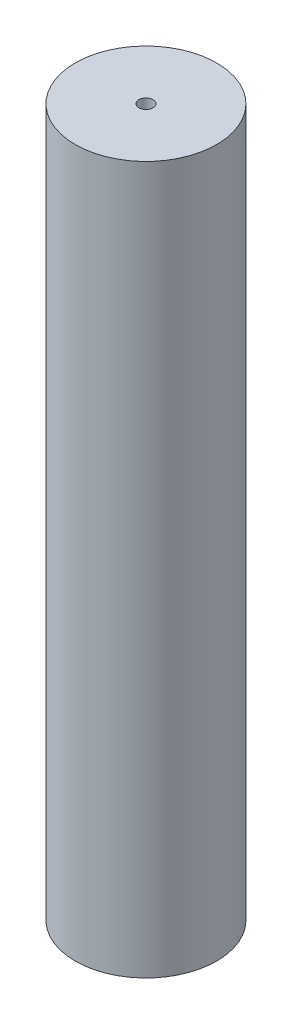
ISO-10303-21;
HEADER;
FILE_DESCRIPTION(('STEP AP214'),'2;1');
FILE_NAME('part.step','',(''),(''),'','','');
FILE_SCHEMA(('AUTOMOTIVE_DESIGN { 1 0 10303 214 1 1 1 1 }'));
ENDSEC;
DATA;
#1=APPLICATION_CONTEXT('core data for automotive mechanical design processes');
#2=APPLICATION_PROTOCOL_DEFINITION('international standard','automotive_design',2000,#1);
#3=PRODUCT_CONTEXT('',#1,'mechanical');
#4=PRODUCT('Part','Part','',(#3));
#5=PRODUCT_RELATED_PRODUCT_CATEGORY('part','',(#4));
#6=PRODUCT_DEFINITION_FORMATION('','',#4);
#7=PRODUCT_DEFINITION_CONTEXT('part definition',#1,'design');
#8=PRODUCT_DEFINITION('design','',#6,#7);
#9=PRODUCT_DEFINITION_SHAPE('','',#8);
#10=(LENGTH_UNIT() NAMED_UNIT(*) SI_UNIT(.MILLI.,.METRE.));
#11=(NAMED_UNIT(*) PLANE_ANGLE_UNIT() SI_UNIT($,.RADIAN.));
#12=(NAMED_UNIT(*) SI_UNIT($,.STERADIAN.) SOLID_ANGLE_UNIT());
#13=UNCERTAINTY_MEASURE_WITH_UNIT(LENGTH_MEASURE(1.E-05),#10,'distance_accuracy_value','');
#14=(GEOMETRIC_REPRESENTATION_CONTEXT(3) GLOBAL_UNCERTAINTY_ASSIGNED_CONTEXT((#13)) GLOBAL_UNIT_ASSIGNED_CONTEXT((#10,
#11,#12)) REPRESENTATION_CONTEXT('',''));
#15=CARTESIAN_POINT('',(0.,0.,0.));
#16=DIRECTION('',(0.,0.,1.));
#17=DIRECTION('',(1.,0.,0.));
#18=AXIS2_PLACEMENT_3D('',#15,#16,#17);
#19=CARTESIAN_POINT('',(0.,1000.,0.));
#20=DIRECTION('',(0.,1.,0.));
#21=DIRECTION('',(0.,0.,1.));
#22=AXIS2_PLACEMENT_3D('',#19,#20,#21);
#23=PLANE('',#22);
#24=CARTESIAN_POINT('',(0.,1000.,0.));
#25=DIRECTION('',(0.,1.,0.));
#26=DIRECTION('',(0.,0.,1.));
#27=AXIS2_PLACEMENT_3D('',#24,#25,#26);
#28=CIRCLE('',#27,100.);
#29=CARTESIAN_POINT('',(0.,1000.,100.));
#30=VERTEX_POINT('',#29);
#31=EDGE_CURVE('E10',#30,#30,#28,.T.);
#32=ORIENTED_EDGE('',*,*,#31,.T.);
#33=EDGE_LOOP('',(#32));
#34=FACE_BOUND('',#33,.T.);
#35=CARTESIAN_POINT('',(0.,1000.,0.));
#36=DIRECTION('',(0.,1.,0.));
#37=DIRECTION('',(0.,0.,1.));
#38=AXIS2_PLACEMENT_3D('',#35,#36,#37);
#39=CIRCLE('',#38,10.);
#40=CARTESIAN_POINT('',(0.,1000.,10.));
#41=VERTEX_POINT('',#40);
#42=EDGE_CURVE('E54',#41,#41,#39,.T.);
#43=ORIENTED_EDGE('',*,*,#42,.F.);
#44=EDGE_LOOP('',(#43));
#45=FACE_BOUND('',#44,.T.);
#46=ADVANCED_FACE('F41',(#34,#45),#23,.T.);
#47=CARTESIAN_POINT('',(0.,0.,0.));
#48=DIRECTION('',(0.,1.,0.));
#49=DIRECTION('',(0.,0.,1.));
#50=AXIS2_PLACEMENT_3D('',#47,#48,#49);
#51=PLANE('',#50);
#52=CARTESIAN_POINT('',(0.,0.,0.));
#53=DIRECTION('',(0.,1.,0.));
#54=DIRECTION('',(0.,0.,1.));
#55=AXIS2_PLACEMENT_3D('',#52,#53,#54);
#56=CIRCLE('',#55,100.);
#57=CARTESIAN_POINT('',(0.,0.,100.));
#58=VERTEX_POINT('',#57);
#59=EDGE_CURVE('E45',#58,#58,#56,.T.);
#60=ORIENTED_EDGE('',*,*,#59,.F.);
#61=EDGE_LOOP('',(#60));
#62=FACE_BOUND('',#61,.T.);
#63=CARTESIAN_POINT('',(0.,0.,0.));
#64=DIRECTION('',(0.,1.,0.));
#65=DIRECTION('',(0.,0.,1.));
#66=AXIS2_PLACEMENT_3D('',#63,#64,#65);
#67=CIRCLE('',#66,10.);
#68=CARTESIAN_POINT('',(0.,0.,10.));
#69=VERTEX_POINT('',#68);
#70=EDGE_CURVE('E56',#69,#69,#67,.T.);
#71=ORIENTED_EDGE('',*,*,#70,.T.);
#72=EDGE_LOOP('',(#71));
#73=FACE_BOUND('',#72,.T.);
#74=ADVANCED_FACE('F68',(#62,#73),#51,.F.);
#75=CARTESIAN_POINT('',(0.,1000.,0.));
#76=DIRECTION('',(0.,-1.,0.));
#77=DIRECTION('',(0.,0.,-1.));
#78=AXIS2_PLACEMENT_3D('',#75,#76,#77);
#79=CYLINDRICAL_SURFACE('',#78,100.);
#80=ORIENTED_EDGE('',*,*,#31,.F.);
#81=EDGE_LOOP('',(#80));
#82=FACE_BOUND('',#81,.T.);
#83=ORIENTED_EDGE('',*,*,#59,.T.);
#84=EDGE_LOOP('',(#83));
#85=FACE_BOUND('',#84,.T.);
#86=ADVANCED_FACE('F43',(#82,#85),#79,.T.);
#87=CARTESIAN_POINT('',(0.,1000.,0.));
#88=DIRECTION('',(0.,-1.,0.));
#89=DIRECTION('',(0.,0.,-1.));
#90=AXIS2_PLACEMENT_3D('',#87,#88,#89);
#91=CYLINDRICAL_SURFACE('',#90,10.);
#92=ORIENTED_EDGE('',*,*,#42,.T.);
#93=EDGE_LOOP('',(#92));
#94=FACE_BOUND('',#93,.T.);
#95=ORIENTED_EDGE('',*,*,#70,.F.);
#96=EDGE_LOOP('',(#95));
#97=FACE_BOUND('',#96,.T.);
#98=ADVANCED_FACE('F64',(#94,#97),#91,.F.);
#99=CLOSED_SHELL('',(#46,#74,#86,#98));
#100=MANIFOLD_SOLID_BREP('B2',#99);
#101=ADVANCED_BREP_SHAPE_REPRESENTATION('',(#18,#100),#14);
#102=SHAPE_DEFINITION_REPRESENTATION(#9,#101);
ENDSEC;
END-ISO-10303-21;
